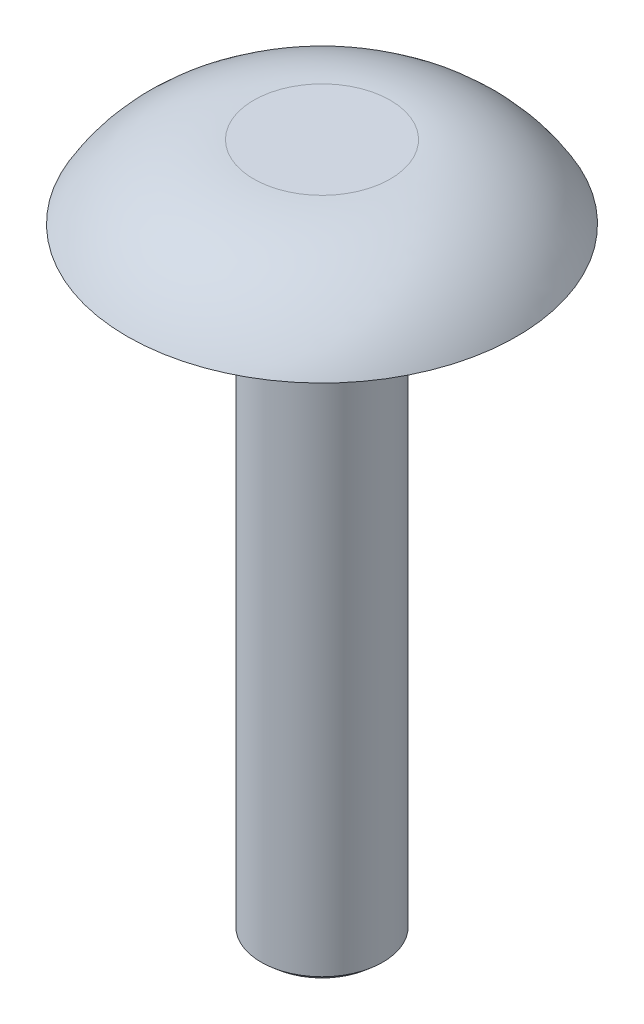
ISO-10303-21;
HEADER;
FILE_DESCRIPTION(('STEP AP214'),'2;1');
FILE_NAME('part.step','',(''),(''),'','','');
FILE_SCHEMA(('AUTOMOTIVE_DESIGN { 1 0 10303 214 1 1 1 1 }'));
ENDSEC;
DATA;
#1=APPLICATION_CONTEXT('core data for automotive mechanical design processes');
#2=APPLICATION_PROTOCOL_DEFINITION('international standard','automotive_design',2000,#1);
#3=PRODUCT_CONTEXT('',#1,'mechanical');
#4=PRODUCT('Part','Part','',(#3));
#5=PRODUCT_RELATED_PRODUCT_CATEGORY('part','',(#4));
#6=PRODUCT_DEFINITION_FORMATION('','',#4);
#7=PRODUCT_DEFINITION_CONTEXT('part definition',#1,'design');
#8=PRODUCT_DEFINITION('design','',#6,#7);
#9=PRODUCT_DEFINITION_SHAPE('','',#8);
#10=(LENGTH_UNIT() NAMED_UNIT(*) SI_UNIT(.MILLI.,.METRE.));
#11=(NAMED_UNIT(*) PLANE_ANGLE_UNIT() SI_UNIT($,.RADIAN.));
#12=(NAMED_UNIT(*) SI_UNIT($,.STERADIAN.) SOLID_ANGLE_UNIT());
#13=UNCERTAINTY_MEASURE_WITH_UNIT(LENGTH_MEASURE(1.E-05),#10,'distance_accuracy_value','');
#14=(GEOMETRIC_REPRESENTATION_CONTEXT(3) GLOBAL_UNCERTAINTY_ASSIGNED_CONTEXT((#13)) GLOBAL_UNIT_ASSIGNED_CONTEXT((#10,
#11,#12)) REPRESENTATION_CONTEXT('',''));
#15=CARTESIAN_POINT('',(0.,0.,0.));
#16=DIRECTION('',(0.,0.,1.));
#17=DIRECTION('',(1.,0.,0.));
#18=AXIS2_PLACEMENT_3D('',#15,#16,#17);
#19=CARTESIAN_POINT('',(0.,1.8125,0.));
#20=DIRECTION('',(0.,-1.,0.));
#21=DIRECTION('',(-1.,0.,0.));
#22=AXIS2_PLACEMENT_3D('',#19,#20,#21);
#23=SPHERICAL_SURFACE('',#22,1.8125);
#24=CARTESIAN_POINT('',(0.,0.5,0.));
#25=DIRECTION('',(0.,-1.,0.));
#26=DIRECTION('',(0.,0.,-1.));
#27=AXIS2_PLACEMENT_3D('',#24,#25,#26);
#28=CIRCLE('',#27,1.25);
#29=CARTESIAN_POINT('',(0.,0.5,-1.25));
#30=VERTEX_POINT('',#29);
#31=EDGE_CURVE('E52',#30,#30,#28,.T.);
#32=ORIENTED_EDGE('',*,*,#31,.T.);
#33=EDGE_LOOP('',(#32));
#34=FACE_BOUND('',#33,.T.);
#35=ADVANCED_FACE('F30',(#34),#23,.T.);
#36=CARTESIAN_POINT('',(1.40192378864668,14.5,0.));
#37=DIRECTION('',(0.,1.,0.));
#38=DIRECTION('',(0.,0.,1.));
#39=AXIS2_PLACEMENT_3D('',#36,#37,#38);
#40=PLANE('',#39);
#41=CARTESIAN_POINT('',(0.,14.5,0.));
#42=DIRECTION('',(0.,-1.,0.));
#43=DIRECTION('',(0.,0.,-1.));
#44=AXIS2_PLACEMENT_3D('',#41,#42,#43);
#45=CIRCLE('',#44,1.40192378864668);
#46=CARTESIAN_POINT('',(0.,14.5,-1.40192378864668));
#47=VERTEX_POINT('',#46);
#48=EDGE_CURVE('E10',#47,#47,#45,.T.);
#49=ORIENTED_EDGE('',*,*,#48,.F.);
#50=EDGE_LOOP('',(#49));
#51=FACE_BOUND('',#50,.T.);
#52=ADVANCED_FACE('F69',(#51),#40,.T.);
#53=CARTESIAN_POINT('',(0.,11.5,0.));
#54=DIRECTION('',(0.,-1.,0.));
#55=DIRECTION('',(0.,0.,-1.));
#56=AXIS2_PLACEMENT_3D('',#53,#54,#55);
#57=DEGENERATE_TOROIDAL_SURFACE('',#56,1.40192378864668,3.,.T.);
#58=ORIENTED_EDGE('',*,*,#48,.T.);
#59=EDGE_LOOP('',(#58));
#60=FACE_BOUND('',#59,.T.);
#61=CARTESIAN_POINT('',(0.,13.,0.));
#62=DIRECTION('',(0.,-1.,0.));
#63=DIRECTION('',(0.,0.,-1.));
#64=AXIS2_PLACEMENT_3D('',#61,#62,#63);
#65=CIRCLE('',#64,4.);
#66=CARTESIAN_POINT('',(0.,13.,-4.));
#67=VERTEX_POINT('',#66);
#68=EDGE_CURVE('E36',#67,#67,#65,.T.);
#69=ORIENTED_EDGE('',*,*,#68,.F.);
#70=EDGE_LOOP('',(#69));
#71=FACE_BOUND('',#70,.T.);
#72=ADVANCED_FACE('F73',(#60,#71),#57,.T.);
#73=CARTESIAN_POINT('',(4.,13.,0.));
#74=DIRECTION('',(0.,-1.,0.));
#75=DIRECTION('',(0.,0.,-1.));
#76=AXIS2_PLACEMENT_3D('',#73,#74,#75);
#77=PLANE('',#76);
#78=ORIENTED_EDGE('',*,*,#68,.T.);
#79=EDGE_LOOP('',(#78));
#80=FACE_BOUND('',#79,.T.);
#81=CARTESIAN_POINT('',(0.,13.,0.));
#82=DIRECTION('',(0.,-1.,0.));
#83=DIRECTION('',(0.,0.,-1.));
#84=AXIS2_PLACEMENT_3D('',#81,#82,#83);
#85=CIRCLE('',#84,3.);
#86=CARTESIAN_POINT('',(0.,13.,-3.));
#87=VERTEX_POINT('',#86);
#88=EDGE_CURVE('E40',#87,#87,#85,.T.);
#89=ORIENTED_EDGE('',*,*,#88,.F.);
#90=EDGE_LOOP('',(#89));
#91=FACE_BOUND('',#90,.T.);
#92=ADVANCED_FACE('F78',(#80,#91),#77,.T.);
#93=CARTESIAN_POINT('',(0.,0.,0.));
#94=DIRECTION('',(0.,-1.,0.));
#95=DIRECTION('',(0.,0.,-1.));
#96=AXIS2_PLACEMENT_3D('',#93,#94,#95);
#97=CYLINDRICAL_SURFACE('',#96,3.);
#98=ORIENTED_EDGE('',*,*,#88,.T.);
#99=EDGE_LOOP('',(#98));
#100=FACE_BOUND('',#99,.T.);
#101=CARTESIAN_POINT('',(0.,13.5,0.));
#102=DIRECTION('',(0.,-1.,0.));
#103=DIRECTION('',(0.,0.,-1.));
#104=AXIS2_PLACEMENT_3D('',#101,#102,#103);
#105=CIRCLE('',#104,3.);
#106=CARTESIAN_POINT('',(0.,13.5,-3.));
#107=VERTEX_POINT('',#106);
#108=EDGE_CURVE('E44',#107,#107,#105,.T.);
#109=ORIENTED_EDGE('',*,*,#108,.F.);
#110=EDGE_LOOP('',(#109));
#111=FACE_BOUND('',#110,.T.);
#112=ADVANCED_FACE('F65',(#100,#111),#97,.F.);
#113=CARTESIAN_POINT('',(3.,13.5,0.));
#114=DIRECTION('',(0.,-1.,0.));
#115=DIRECTION('',(0.,0.,-1.));
#116=AXIS2_PLACEMENT_3D('',#113,#114,#115);
#117=PLANE('',#116);
#118=ORIENTED_EDGE('',*,*,#108,.T.);
#119=EDGE_LOOP('',(#118));
#120=FACE_BOUND('',#119,.T.);
#121=CARTESIAN_POINT('',(0.,13.5,0.));
#122=DIRECTION('',(0.,-1.,0.));
#123=DIRECTION('',(0.,0.,-1.));
#124=AXIS2_PLACEMENT_3D('',#121,#122,#123);
#125=CIRCLE('',#124,1.25);
#126=CARTESIAN_POINT('',(0.,13.5,-1.25));
#127=VERTEX_POINT('',#126);
#128=EDGE_CURVE('E49',#127,#127,#125,.T.);
#129=ORIENTED_EDGE('',*,*,#128,.F.);
#130=EDGE_LOOP('',(#129));
#131=FACE_BOUND('',#130,.T.);
#132=ADVANCED_FACE('F59',(#120,#131),#117,.T.);
#133=CARTESIAN_POINT('',(0.,0.,0.));
#134=DIRECTION('',(0.,-1.,0.));
#135=DIRECTION('',(0.,0.,-1.));
#136=AXIS2_PLACEMENT_3D('',#133,#134,#135);
#137=CYLINDRICAL_SURFACE('',#136,1.25);
#138=ORIENTED_EDGE('',*,*,#128,.T.);
#139=EDGE_LOOP('',(#138));
#140=FACE_BOUND('',#139,.T.);
#141=ORIENTED_EDGE('',*,*,#31,.F.);
#142=EDGE_LOOP('',(#141));
#143=FACE_BOUND('',#142,.T.);
#144=ADVANCED_FACE('F57',(#140,#143),#137,.T.);
#145=CLOSED_SHELL('',(#35,#52,#72,#92,#112,#132,#144));
#146=MANIFOLD_SOLID_BREP('B2',#145);
#147=ADVANCED_BREP_SHAPE_REPRESENTATION('',(#18,#146),#14);
#148=SHAPE_DEFINITION_REPRESENTATION(#9,#147);
ENDSEC;
END-ISO-10303-21;
